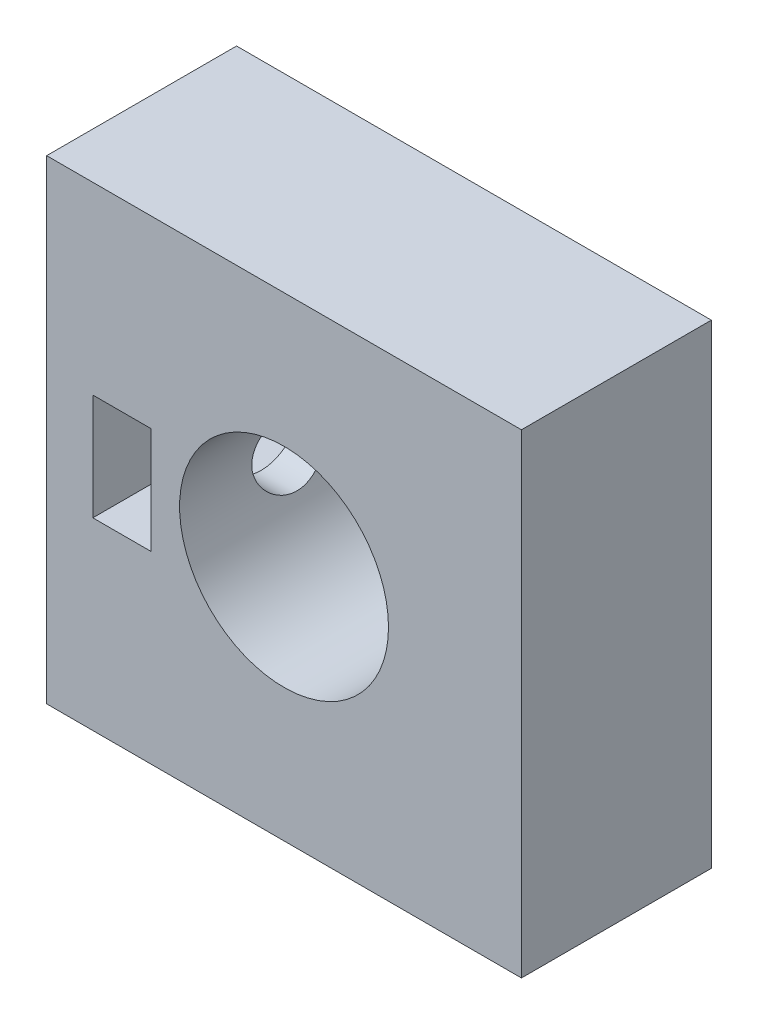
ISO-10303-21;
HEADER;
FILE_DESCRIPTION(('STEP AP214'),'2;1');
FILE_NAME('part.step','',(''),(''),'','','');
FILE_SCHEMA(('AUTOMOTIVE_DESIGN { 1 0 10303 214 1 1 1 1 }'));
ENDSEC;
DATA;
#1=APPLICATION_CONTEXT('core data for automotive mechanical design processes');
#2=APPLICATION_PROTOCOL_DEFINITION('international standard','automotive_design',2000,#1);
#3=PRODUCT_CONTEXT('',#1,'mechanical');
#4=PRODUCT('Part','Part','',(#3));
#5=PRODUCT_RELATED_PRODUCT_CATEGORY('part','',(#4));
#6=PRODUCT_DEFINITION_FORMATION('','',#4);
#7=PRODUCT_DEFINITION_CONTEXT('part definition',#1,'design');
#8=PRODUCT_DEFINITION('design','',#6,#7);
#9=PRODUCT_DEFINITION_SHAPE('','',#8);
#10=(LENGTH_UNIT() NAMED_UNIT(*) SI_UNIT(.MILLI.,.METRE.));
#11=(NAMED_UNIT(*) PLANE_ANGLE_UNIT() SI_UNIT($,.RADIAN.));
#12=(NAMED_UNIT(*) SI_UNIT($,.STERADIAN.) SOLID_ANGLE_UNIT());
#13=UNCERTAINTY_MEASURE_WITH_UNIT(LENGTH_MEASURE(1.E-05),#10,'distance_accuracy_value','');
#14=(GEOMETRIC_REPRESENTATION_CONTEXT(3) GLOBAL_UNCERTAINTY_ASSIGNED_CONTEXT((#13)) GLOBAL_UNIT_ASSIGNED_CONTEXT((#10,
#11,#12)) REPRESENTATION_CONTEXT('',''));
#15=CARTESIAN_POINT('',(0.,0.,0.));
#16=DIRECTION('',(0.,0.,1.));
#17=DIRECTION('',(1.,0.,0.));
#18=AXIS2_PLACEMENT_3D('',#15,#16,#17);
#19=CARTESIAN_POINT('',(25.001,12.5,4.2));
#20=DIRECTION('',(-1.,0.,0.));
#21=DIRECTION('',(0.,0.,1.));
#22=AXIS2_PLACEMENT_3D('',#19,#20,#21);
#23=CYLINDRICAL_SURFACE('',#22,2.);
#24=CARTESIAN_POINT('',(5.5,12.5,4.2));
#25=DIRECTION('',(1.,0.,0.));
#26=DIRECTION('',(0.,1.,0.));
#27=AXIS2_PLACEMENT_3D('',#24,#25,#26);
#28=CIRCLE('',#27,2.);
#29=CARTESIAN_POINT('',(5.5,14.5,4.2));
#30=VERTEX_POINT('',#29);
#31=EDGE_CURVE('E47',#30,#30,#28,.F.);
#32=ORIENTED_EDGE('',*,*,#31,.T.);
#33=EDGE_LOOP('',(#32));
#34=FACE_BOUND('',#33,.T.);
#35=CARTESIAN_POINT('',(7.,12.5,6.2));
#36=CARTESIAN_POINT('',(6.99999794342816,12.6085431672249,6.20000281292602));
#37=CARTESIAN_POINT('',(7.00324161817553,12.7170665360462,6.1911358052542));
#38=CARTESIAN_POINT('',(7.0158585249185,12.9308827933233,6.15603554483228));
#39=CARTESIAN_POINT('',(7.02523128593243,13.0361759293513,6.1298036264643));
#40=CARTESIAN_POINT('',(7.04909674326055,13.2404179654644,6.06101528815362));
#41=CARTESIAN_POINT('',(7.06357992514015,13.3393782541217,6.01848919169199));
#42=CARTESIAN_POINT('',(7.09621372899939,13.5287562128613,5.91846905188594));
#43=CARTESIAN_POINT('',(7.11436526886419,13.6191717365726,5.86097126133008));
#44=CARTESIAN_POINT('',(7.15326911496755,13.7925369499083,5.73021601681446));
#45=CARTESIAN_POINT('',(7.17409194403198,13.8750961278637,5.65646195228708));
#46=CARTESIAN_POINT('',(7.21563327218678,14.026983991615,5.49634225120092));
#47=CARTESIAN_POINT('',(7.23635174047298,14.0963089710615,5.40997309359733));
#48=CARTESIAN_POINT('',(7.2761461440181,14.2221704096503,5.22334495048998));
#49=CARTESIAN_POINT('',(7.29513806133193,14.2781677994308,5.12270272781146));
#50=CARTESIAN_POINT('',(7.32823877426068,14.3722693944008,4.91262852397039));
#51=CARTESIAN_POINT('',(7.34234938754203,14.4103802619401,4.8031998333952));
#52=CARTESIAN_POINT('',(7.36333912500422,14.4661067634546,4.58314134325153));
#53=CARTESIAN_POINT('',(7.37047896378303,14.4844641700975,4.47272506430788));
#54=CARTESIAN_POINT('',(7.37748422482791,14.5024821815333,4.25016624423009));
#55=CARTESIAN_POINT('',(7.37735242568596,14.5021499278993,4.13802437884144));
#56=CARTESIAN_POINT('',(7.3700551493659,14.4833676776718,3.92184779746492));
#57=CARTESIAN_POINT('',(7.36328211787463,14.4659285422237,3.81770959476474));
#58=CARTESIAN_POINT('',(7.34411489193708,14.4150924205277,3.61395353831255));
#59=CARTESIAN_POINT('',(7.33171990186375,14.3816931755481,3.51433632657303));
#60=CARTESIAN_POINT('',(7.30245712686712,14.2993004854822,3.32032363741823));
#61=CARTESIAN_POINT('',(7.28551210317722,14.250034505005,3.22605605995486));
#62=CARTESIAN_POINT('',(7.24908614062466,14.1374964656257,3.04682524845191));
#63=CARTESIAN_POINT('',(7.22960436503733,14.0742197805742,2.96186510148504));
#64=CARTESIAN_POINT('',(7.18880430043774,13.9307667594366,2.79804029049532));
#65=CARTESIAN_POINT('',(7.16744756957088,13.849777828231,2.71989508613055));
#66=CARTESIAN_POINT('',(7.12636250159321,13.675592878266,2.57808898950546));
#67=CARTESIAN_POINT('',(7.10663438598709,13.582395203464,2.51443006543378));
#68=CARTESIAN_POINT('',(7.07067780305726,13.3846914824781,2.40267283750855));
#69=CARTESIAN_POINT('',(7.05450124397144,13.280047440424,2.35480077706101));
#70=CARTESIAN_POINT('',(7.02785279306558,13.063457919123,2.27757485738342));
#71=CARTESIAN_POINT('',(7.01737852522859,12.9515155027507,2.24821328444097));
#72=CARTESIAN_POINT('',(7.00372571036465,12.7295721673527,2.21019398692595));
#73=CARTESIAN_POINT('',(7.00020577134466,12.6197581889351,2.20056653550709));
#74=CARTESIAN_POINT('',(6.99981204681246,12.4000408664372,2.19948246482137));
#75=CARTESIAN_POINT('',(7.00293689098158,12.2901375454538,2.20802209905218));
#76=CARTESIAN_POINT('',(7.01525607764047,12.0774637392691,2.24228340641591));
#77=CARTESIAN_POINT('',(7.02422990768353,11.9745786654119,2.26738122465903));
#78=CARTESIAN_POINT('',(7.04712411168664,11.7745428299039,2.33323685616544));
#79=CARTESIAN_POINT('',(7.06104512899462,11.6773928159755,2.37399670622505));
#80=CARTESIAN_POINT('',(7.09294428249921,11.4884692236079,2.47129555674054));
#81=CARTESIAN_POINT('',(7.11102727125547,11.3969295666414,2.52825334973441));
#82=CARTESIAN_POINT('',(7.14923477425007,11.2244093229434,2.65585309986756));
#83=CARTESIAN_POINT('',(7.1693600076108,11.1434324787261,2.72649988524277));
#84=CARTESIAN_POINT('',(7.21078819643165,10.9897284498612,2.88400778815019));
#85=CARTESIAN_POINT('',(7.23209558343487,10.9176910120734,2.97154255812715));
#86=CARTESIAN_POINT('',(7.27240671306496,10.7892058984758,3.15789098345244));
#87=CARTESIAN_POINT('',(7.29141031145347,10.7327591985071,3.25670534425575));
#88=CARTESIAN_POINT('',(7.32484580725239,10.6371081480892,3.46337294723393));
#89=CARTESIAN_POINT('',(7.33926798643325,10.5979403827106,3.57124479804183));
#90=CARTESIAN_POINT('',(7.36153912350902,10.5385604532528,3.79271744789138));
#91=CARTESIAN_POINT('',(7.36939182082966,10.5183375047765,3.90631494872743));
#92=CARTESIAN_POINT('',(7.37715771829315,10.4983529894228,4.12859130815924));
#93=CARTESIAN_POINT('',(7.3775237644467,10.4974243101218,4.23715036773967));
#94=CARTESIAN_POINT('',(7.37142433024002,10.5130976745463,4.45278956675328));
#95=CARTESIAN_POINT('',(7.36495942109043,10.5296982524593,4.55986982908634));
#96=CARTESIAN_POINT('',(7.34629282403714,10.5790717406572,4.76659495573479));
#97=CARTESIAN_POINT('',(7.33425053971135,10.6113964637173,4.86636245919753));
#98=CARTESIAN_POINT('',(7.30586986576045,10.6909157739188,5.05912278008991));
#99=CARTESIAN_POINT('',(7.28953042275555,10.738114007627,5.15211392925675));
#100=CARTESIAN_POINT('',(7.25337759474684,10.8487885205222,5.33374145419998));
#101=CARTESIAN_POINT('',(7.23343119744328,10.9129617358193,5.42192639618456));
#102=CARTESIAN_POINT('',(7.19279598494814,11.0546582751306,5.58665015167869));
#103=CARTESIAN_POINT('',(7.17210694266511,11.1321857107047,5.66318536470404));
#104=CARTESIAN_POINT('',(7.13108393851245,11.3029963010183,5.80629946628907));
#105=CARTESIAN_POINT('',(7.11081858749006,11.3968705459705,5.87219549980303));
#106=CARTESIAN_POINT('',(7.07402197105699,11.5950641521281,5.98723707557175));
#107=CARTESIAN_POINT('',(7.05749062423752,11.6993832855424,6.03638298302485));
#108=CARTESIAN_POINT('',(7.02980096272137,11.9175771832974,6.1169096678729));
#109=CARTESIAN_POINT('',(7.01874574097715,12.0315911395072,6.14795140397753));
#110=CARTESIAN_POINT('',(7.00384792118736,12.2637457367565,6.18949064559972));
#111=CARTESIAN_POINT('',(7.00000223793751,12.3818845905564,6.1999969390067));
#112=CARTESIAN_POINT('',(7.,12.5,6.2));
#113=B_SPLINE_CURVE_WITH_KNOTS('',3,(#35,#36,#37,#38,#39,#40,#41,#42,#43,#44,#45,#46,#47,#48,
#49,#50,#51,#52,#53,#54,#55,#56,#57,#58,#59,#60,#61,#62,#63,#64,#65,#66,#67,#68,#69,#70,#71,#72,
#73,#74,#75,#76,#77,#78,#79,#80,#81,#82,#83,#84,#85,#86,#87,#88,#89,#90,#91,#92,#93,#94,#95,#96,
#97,#98,#99,#100,#101,#102,#103,#104,#105,#106,#107,#108,#109,#110,#111,#112),.UNSPECIFIED.,.T.,
.F.,(4,2,2,2,2,2,2,2,2,2,2,2,2,2,2,2,2,2,2,2,2,2,2,2,2,2,2,2,2,2,2,2,2,2,2,2,2,2,4),(0.,
0.325194104136431,0.65036322209004,0.97493011631894,1.2995783234422,1.63601964163853,
1.97255504528971,2.32099392094053,2.66930290729856,3.00401939097088,3.33860797579858,
3.65454759073094,3.97053193181531,4.29226244373356,4.61409934564612,4.95617818949658,
5.29830348241717,5.6451379260558,5.99182774072784,6.32102805388949,6.65016048438683,
6.96755079702181,7.2849823992121,7.61151258405805,7.93815814949471,8.28259860829996,
8.62706062112335,8.97224851093866,9.31723978183251,9.64129740492555,9.96532793217199,
10.2806204101951,10.5959902492892,10.9271566786297,11.2584252518918,11.6061385710831,
11.9538443086926,12.3078682758854,12.6617407096898),.UNSPECIFIED.);
#114=CARTESIAN_POINT('',(7.,12.5,6.2));
#115=VERTEX_POINT('',#114);
#116=EDGE_CURVE('E166',#115,#115,#113,.T.);
#117=ORIENTED_EDGE('',*,*,#116,.F.);
#118=EDGE_LOOP('',(#117));
#119=FACE_BOUND('',#118,.T.);
#120=ADVANCED_FACE('F43',(#34,#119),#23,.F.);
#121=CARTESIAN_POINT('',(0.,0.,10.));
#122=DIRECTION('',(0.,0.,-1.));
#123=DIRECTION('',(-1.,0.,0.));
#124=AXIS2_PLACEMENT_3D('',#121,#122,#123);
#125=PLANE('',#124);
#126=DIRECTION('',(1.,0.,0.));
#127=VECTOR('',#126,1.);
#128=CARTESIAN_POINT('',(5.5,15.3,10.));
#129=LINE('',#128,#127);
#130=CARTESIAN_POINT('',(2.43195053206035,15.3,10.));
#131=VERTEX_POINT('',#130);
#132=CARTESIAN_POINT('',(5.5,15.3,10.));
#133=VERTEX_POINT('',#132);
#134=EDGE_CURVE('E121',#131,#133,#129,.T.);
#135=ORIENTED_EDGE('',*,*,#134,.T.);
#136=DIRECTION('',(0.,-1.,0.));
#137=VECTOR('',#136,1.);
#138=CARTESIAN_POINT('',(5.5,15.3,10.));
#139=LINE('',#138,#137);
#140=CARTESIAN_POINT('',(5.5,9.7,10.));
#141=VERTEX_POINT('',#140);
#142=EDGE_CURVE('E114',#133,#141,#139,.T.);
#143=ORIENTED_EDGE('',*,*,#142,.T.);
#144=DIRECTION('',(-1.,0.,0.));
#145=VECTOR('',#144,1.);
#146=CARTESIAN_POINT('',(5.5,9.7,10.));
#147=LINE('',#146,#145);
#148=CARTESIAN_POINT('',(2.43195053206035,9.7,10.));
#149=VERTEX_POINT('',#148);
#150=EDGE_CURVE('E124',#141,#149,#147,.T.);
#151=ORIENTED_EDGE('',*,*,#150,.T.);
#152=DIRECTION('',(0.,1.,0.));
#153=VECTOR('',#152,1.);
#154=CARTESIAN_POINT('',(2.43195053206035,15.3,10.));
#155=LINE('',#154,#153);
#156=EDGE_CURVE('E61',#149,#131,#155,.T.);
#157=ORIENTED_EDGE('',*,*,#156,.T.);
#158=EDGE_LOOP('',(#135,#143,#151,#157));
#159=FACE_BOUND('',#158,.T.);
#160=DIRECTION('',(0.,-1.,0.));
#161=VECTOR('',#160,1.);
#162=CARTESIAN_POINT('',(0.,0.,10.));
#163=LINE('',#162,#161);
#164=CARTESIAN_POINT('',(0.,25.,10.));
#165=VERTEX_POINT('',#164);
#166=CARTESIAN_POINT('',(0.,0.,10.));
#167=VERTEX_POINT('',#166);
#168=EDGE_CURVE('E246',#165,#167,#163,.T.);
#169=ORIENTED_EDGE('',*,*,#168,.T.);
#170=DIRECTION('',(1.,0.,0.));
#171=VECTOR('',#170,1.);
#172=CARTESIAN_POINT('',(0.,0.,10.));
#173=LINE('',#172,#171);
#174=CARTESIAN_POINT('',(25.,0.,10.));
#175=VERTEX_POINT('',#174);
#176=EDGE_CURVE('E266',#167,#175,#173,.T.);
#177=ORIENTED_EDGE('',*,*,#176,.T.);
#178=DIRECTION('',(0.,1.,0.));
#179=VECTOR('',#178,1.);
#180=CARTESIAN_POINT('',(25.,0.,10.));
#181=LINE('',#180,#179);
#182=CARTESIAN_POINT('',(25.,25.,10.));
#183=VERTEX_POINT('',#182);
#184=EDGE_CURVE('E268',#175,#183,#181,.T.);
#185=ORIENTED_EDGE('',*,*,#184,.T.);
#186=DIRECTION('',(-1.,0.,0.));
#187=VECTOR('',#186,1.);
#188=CARTESIAN_POINT('',(0.,25.,10.));
#189=LINE('',#188,#187);
#190=EDGE_CURVE('E238',#183,#165,#189,.T.);
#191=ORIENTED_EDGE('',*,*,#190,.T.);
#192=EDGE_LOOP('',(#169,#177,#185,#191));
#193=FACE_BOUND('',#192,.T.);
#194=CARTESIAN_POINT('',(12.5,12.5,10.));
#195=DIRECTION('',(0.,0.,1.));
#196=DIRECTION('',(1.,0.,0.));
#197=AXIS2_PLACEMENT_3D('',#194,#195,#196);
#198=CIRCLE('',#197,5.5);
#199=CARTESIAN_POINT('',(18.,12.5,10.));
#200=VERTEX_POINT('',#199);
#201=EDGE_CURVE('E175',#200,#200,#198,.T.);
#202=ORIENTED_EDGE('',*,*,#201,.F.);
#203=EDGE_LOOP('',(#202));
#204=FACE_BOUND('',#203,.T.);
#205=ADVANCED_FACE('F129',(#159,#193,#204),#125,.F.);
#206=CARTESIAN_POINT('',(0.,0.,0.));
#207=DIRECTION('',(0.,0.,-1.));
#208=DIRECTION('',(-1.,0.,0.));
#209=AXIS2_PLACEMENT_3D('',#206,#207,#208);
#210=PLANE('',#209);
#211=DIRECTION('',(0.,-1.,0.));
#212=VECTOR('',#211,1.);
#213=CARTESIAN_POINT('',(5.5,15.3,0.));
#214=LINE('',#213,#212);
#215=CARTESIAN_POINT('',(5.5,15.3,0.));
#216=VERTEX_POINT('',#215);
#217=CARTESIAN_POINT('',(5.5,9.7,0.));
#218=VERTEX_POINT('',#217);
#219=EDGE_CURVE('E69',#216,#218,#214,.T.);
#220=ORIENTED_EDGE('',*,*,#219,.F.);
#221=DIRECTION('',(1.,0.,0.));
#222=VECTOR('',#221,1.);
#223=CARTESIAN_POINT('',(5.5,15.3,0.));
#224=LINE('',#223,#222);
#225=CARTESIAN_POINT('',(2.43195053206035,15.3,0.));
#226=VERTEX_POINT('',#225);
#227=EDGE_CURVE('E133',#226,#216,#224,.T.);
#228=ORIENTED_EDGE('',*,*,#227,.F.);
#229=DIRECTION('',(0.,1.,0.));
#230=VECTOR('',#229,1.);
#231=CARTESIAN_POINT('',(2.43195053206035,15.3,0.));
#232=LINE('',#231,#230);
#233=CARTESIAN_POINT('',(2.43195053206035,9.7,0.));
#234=VERTEX_POINT('',#233);
#235=EDGE_CURVE('E137',#234,#226,#232,.T.);
#236=ORIENTED_EDGE('',*,*,#235,.F.);
#237=DIRECTION('',(-1.,0.,0.));
#238=VECTOR('',#237,1.);
#239=CARTESIAN_POINT('',(5.5,9.7,0.));
#240=LINE('',#239,#238);
#241=EDGE_CURVE('E146',#218,#234,#240,.T.);
#242=ORIENTED_EDGE('',*,*,#241,.F.);
#243=EDGE_LOOP('',(#220,#228,#236,#242));
#244=FACE_BOUND('',#243,.T.);
#245=DIRECTION('',(0.,-1.,0.));
#246=VECTOR('',#245,1.);
#247=CARTESIAN_POINT('',(0.,0.,0.));
#248=LINE('',#247,#246);
#249=CARTESIAN_POINT('',(0.,25.,0.));
#250=VERTEX_POINT('',#249);
#251=CARTESIAN_POINT('',(0.,0.,0.));
#252=VERTEX_POINT('',#251);
#253=EDGE_CURVE('E223',#250,#252,#248,.T.);
#254=ORIENTED_EDGE('',*,*,#253,.F.);
#255=DIRECTION('',(-1.,0.,0.));
#256=VECTOR('',#255,1.);
#257=CARTESIAN_POINT('',(0.,25.,0.));
#258=LINE('',#257,#256);
#259=CARTESIAN_POINT('',(25.,25.,0.));
#260=VERTEX_POINT('',#259);
#261=EDGE_CURVE('E243',#260,#250,#258,.T.);
#262=ORIENTED_EDGE('',*,*,#261,.F.);
#263=DIRECTION('',(0.,1.,0.));
#264=VECTOR('',#263,1.);
#265=CARTESIAN_POINT('',(25.,0.,0.));
#266=LINE('',#265,#264);
#267=CARTESIAN_POINT('',(25.,0.,0.));
#268=VERTEX_POINT('',#267);
#269=EDGE_CURVE('E234',#268,#260,#266,.T.);
#270=ORIENTED_EDGE('',*,*,#269,.F.);
#271=DIRECTION('',(1.,0.,0.));
#272=VECTOR('',#271,1.);
#273=CARTESIAN_POINT('',(0.,0.,0.));
#274=LINE('',#273,#272);
#275=EDGE_CURVE('E230',#252,#268,#274,.T.);
#276=ORIENTED_EDGE('',*,*,#275,.F.);
#277=EDGE_LOOP('',(#254,#262,#270,#276));
#278=FACE_BOUND('',#277,.T.);
#279=CARTESIAN_POINT('',(12.5,12.5,0.));
#280=DIRECTION('',(0.,0.,1.));
#281=DIRECTION('',(1.,0.,0.));
#282=AXIS2_PLACEMENT_3D('',#279,#280,#281);
#283=CIRCLE('',#282,5.5);
#284=CARTESIAN_POINT('',(18.,12.5,0.));
#285=VERTEX_POINT('',#284);
#286=EDGE_CURVE('E165',#285,#285,#283,.T.);
#287=ORIENTED_EDGE('',*,*,#286,.T.);
#288=EDGE_LOOP('',(#287));
#289=FACE_BOUND('',#288,.T.);
#290=ADVANCED_FACE('F199',(#244,#278,#289),#210,.T.);
#291=CARTESIAN_POINT('',(0.,0.,10.));
#292=DIRECTION('',(1.,0.,0.));
#293=DIRECTION('',(0.,0.,-1.));
#294=AXIS2_PLACEMENT_3D('',#291,#292,#293);
#295=PLANE('',#294);
#296=CARTESIAN_POINT('',(0.,12.5,4.2));
#297=DIRECTION('',(-1.,0.,0.));
#298=DIRECTION('',(0.,0.,1.));
#299=AXIS2_PLACEMENT_3D('',#296,#297,#298);
#300=CIRCLE('',#299,2.);
#301=CARTESIAN_POINT('',(0.,12.5,6.2));
#302=VERTEX_POINT('',#301);
#303=EDGE_CURVE('E161',#302,#302,#300,.T.);
#304=ORIENTED_EDGE('',*,*,#303,.F.);
#305=EDGE_LOOP('',(#304));
#306=FACE_BOUND('',#305,.T.);
#307=ORIENTED_EDGE('',*,*,#253,.T.);
#308=DIRECTION('',(0.,0.,-1.));
#309=VECTOR('',#308,1.);
#310=CARTESIAN_POINT('',(0.,0.,10.));
#311=LINE('',#310,#309);
#312=EDGE_CURVE('E11',#167,#252,#311,.T.);
#313=ORIENTED_EDGE('',*,*,#312,.F.);
#314=ORIENTED_EDGE('',*,*,#168,.F.);
#315=DIRECTION('',(0.,0.,-1.));
#316=VECTOR('',#315,1.);
#317=CARTESIAN_POINT('',(0.,25.,10.));
#318=LINE('',#317,#316);
#319=EDGE_CURVE('E226',#165,#250,#318,.T.);
#320=ORIENTED_EDGE('',*,*,#319,.T.);
#321=EDGE_LOOP('',(#307,#313,#314,#320));
#322=FACE_BOUND('',#321,.T.);
#323=ADVANCED_FACE('F45',(#306,#322),#295,.F.);
#324=CARTESIAN_POINT('',(0.,0.,10.));
#325=DIRECTION('',(0.,1.,0.));
#326=DIRECTION('',(0.,0.,1.));
#327=AXIS2_PLACEMENT_3D('',#324,#325,#326);
#328=PLANE('',#327);
#329=ORIENTED_EDGE('',*,*,#275,.T.);
#330=DIRECTION('',(0.,0.,-1.));
#331=VECTOR('',#330,1.);
#332=CARTESIAN_POINT('',(25.,0.,10.));
#333=LINE('',#332,#331);
#334=EDGE_CURVE('E53',#175,#268,#333,.T.);
#335=ORIENTED_EDGE('',*,*,#334,.F.);
#336=ORIENTED_EDGE('',*,*,#176,.F.);
#337=ORIENTED_EDGE('',*,*,#312,.T.);
#338=EDGE_LOOP('',(#329,#335,#336,#337));
#339=FACE_BOUND('',#338,.T.);
#340=ADVANCED_FACE('F218',(#339),#328,.F.);
#341=CARTESIAN_POINT('',(25.,0.,10.));
#342=DIRECTION('',(-1.,0.,0.));
#343=DIRECTION('',(0.,0.,1.));
#344=AXIS2_PLACEMENT_3D('',#341,#342,#343);
#345=PLANE('',#344);
#346=ORIENTED_EDGE('',*,*,#269,.T.);
#347=DIRECTION('',(0.,0.,-1.));
#348=VECTOR('',#347,1.);
#349=CARTESIAN_POINT('',(25.,25.,10.));
#350=LINE('',#349,#348);
#351=EDGE_CURVE('E249',#183,#260,#350,.T.);
#352=ORIENTED_EDGE('',*,*,#351,.F.);
#353=ORIENTED_EDGE('',*,*,#184,.F.);
#354=ORIENTED_EDGE('',*,*,#334,.T.);
#355=EDGE_LOOP('',(#346,#352,#353,#354));
#356=FACE_BOUND('',#355,.T.);
#357=ADVANCED_FACE('F278',(#356),#345,.F.);
#358=CARTESIAN_POINT('',(0.,25.,10.));
#359=DIRECTION('',(0.,-1.,0.));
#360=DIRECTION('',(0.,0.,-1.));
#361=AXIS2_PLACEMENT_3D('',#358,#359,#360);
#362=PLANE('',#361);
#363=ORIENTED_EDGE('',*,*,#261,.T.);
#364=ORIENTED_EDGE('',*,*,#319,.F.);
#365=ORIENTED_EDGE('',*,*,#190,.F.);
#366=ORIENTED_EDGE('',*,*,#351,.T.);
#367=EDGE_LOOP('',(#363,#364,#365,#366));
#368=FACE_BOUND('',#367,.T.);
#369=ADVANCED_FACE('F209',(#368),#362,.F.);
#370=CARTESIAN_POINT('',(12.5,12.5,10.));
#371=DIRECTION('',(0.,0.,-1.));
#372=DIRECTION('',(-1.,0.,0.));
#373=AXIS2_PLACEMENT_3D('',#370,#371,#372);
#374=CYLINDRICAL_SURFACE('',#373,5.5);
#375=ORIENTED_EDGE('',*,*,#116,.T.);
#376=EDGE_LOOP('',(#375));
#377=FACE_BOUND('',#376,.T.);
#378=ORIENTED_EDGE('',*,*,#201,.T.);
#379=EDGE_LOOP('',(#378));
#380=FACE_BOUND('',#379,.T.);
#381=ORIENTED_EDGE('',*,*,#286,.F.);
#382=EDGE_LOOP('',(#381));
#383=FACE_BOUND('',#382,.T.);
#384=ADVANCED_FACE('F204',(#377,#380,#383),#374,.F.);
#385=CARTESIAN_POINT('',(2.43195053206035,12.5,4.2));
#386=DIRECTION('',(-1.,0.,0.));
#387=DIRECTION('',(0.,-1.,0.));
#388=AXIS2_PLACEMENT_3D('',#385,#386,#387);
#389=CIRCLE('',#388,2.);
#390=CARTESIAN_POINT('',(2.43195053206035,10.5,4.2));
#391=VERTEX_POINT('',#390);
#392=EDGE_CURVE('E155',#391,#391,#389,.F.);
#393=ORIENTED_EDGE('',*,*,#392,.T.);
#394=EDGE_LOOP('',(#393));
#395=FACE_BOUND('',#394,.T.);
#396=ORIENTED_EDGE('',*,*,#303,.T.);
#397=EDGE_LOOP('',(#396));
#398=FACE_BOUND('',#397,.T.);
#399=ADVANCED_FACE('F177',(#395,#398),#23,.F.);
#400=CARTESIAN_POINT('',(5.5,15.3,10.));
#401=DIRECTION('',(1.,0.,0.));
#402=DIRECTION('',(0.,1.,0.));
#403=AXIS2_PLACEMENT_3D('',#400,#401,#402);
#404=PLANE('',#403);
#405=ORIENTED_EDGE('',*,*,#219,.T.);
#406=DIRECTION('',(0.,0.,-1.));
#407=VECTOR('',#406,1.);
#408=CARTESIAN_POINT('',(5.5,9.7,10.));
#409=LINE('',#408,#407);
#410=EDGE_CURVE('E109',#141,#218,#409,.T.);
#411=ORIENTED_EDGE('',*,*,#410,.F.);
#412=ORIENTED_EDGE('',*,*,#142,.F.);
#413=DIRECTION('',(0.,0.,-1.));
#414=VECTOR('',#413,1.);
#415=CARTESIAN_POINT('',(5.5,15.3,10.));
#416=LINE('',#415,#414);
#417=EDGE_CURVE('E152',#133,#216,#416,.T.);
#418=ORIENTED_EDGE('',*,*,#417,.T.);
#419=EDGE_LOOP('',(#405,#411,#412,#418));
#420=FACE_BOUND('',#419,.T.);
#421=ORIENTED_EDGE('',*,*,#31,.F.);
#422=EDGE_LOOP('',(#421));
#423=FACE_BOUND('',#422,.T.);
#424=ADVANCED_FACE('F111',(#420,#423),#404,.F.);
#425=CARTESIAN_POINT('',(2.43195053206035,15.3,10.));
#426=DIRECTION('',(-1.,0.,0.));
#427=DIRECTION('',(0.,-1.,0.));
#428=AXIS2_PLACEMENT_3D('',#425,#426,#427);
#429=PLANE('',#428);
#430=ORIENTED_EDGE('',*,*,#235,.T.);
#431=DIRECTION('',(0.,0.,-1.));
#432=VECTOR('',#431,1.);
#433=CARTESIAN_POINT('',(2.43195053206035,15.3,10.));
#434=LINE('',#433,#432);
#435=EDGE_CURVE('E156',#131,#226,#434,.T.);
#436=ORIENTED_EDGE('',*,*,#435,.F.);
#437=ORIENTED_EDGE('',*,*,#156,.F.);
#438=DIRECTION('',(0.,0.,-1.));
#439=VECTOR('',#438,1.);
#440=CARTESIAN_POINT('',(2.43195053206035,9.7,10.));
#441=LINE('',#440,#439);
#442=EDGE_CURVE('E120',#149,#234,#441,.T.);
#443=ORIENTED_EDGE('',*,*,#442,.T.);
#444=EDGE_LOOP('',(#430,#436,#437,#443));
#445=FACE_BOUND('',#444,.T.);
#446=ORIENTED_EDGE('',*,*,#392,.F.);
#447=EDGE_LOOP('',(#446));
#448=FACE_BOUND('',#447,.T.);
#449=ADVANCED_FACE('F184',(#445,#448),#429,.F.);
#450=CARTESIAN_POINT('',(5.5,15.3,10.));
#451=DIRECTION('',(0.,1.,0.));
#452=DIRECTION('',(0.,0.,1.));
#453=AXIS2_PLACEMENT_3D('',#450,#451,#452);
#454=PLANE('',#453);
#455=ORIENTED_EDGE('',*,*,#227,.T.);
#456=ORIENTED_EDGE('',*,*,#417,.F.);
#457=ORIENTED_EDGE('',*,*,#134,.F.);
#458=ORIENTED_EDGE('',*,*,#435,.T.);
#459=EDGE_LOOP('',(#455,#456,#457,#458));
#460=FACE_BOUND('',#459,.T.);
#461=ADVANCED_FACE('F187',(#460),#454,.F.);
#462=CARTESIAN_POINT('',(5.5,9.7,10.));
#463=DIRECTION('',(0.,-1.,0.));
#464=DIRECTION('',(0.,0.,-1.));
#465=AXIS2_PLACEMENT_3D('',#462,#463,#464);
#466=PLANE('',#465);
#467=ORIENTED_EDGE('',*,*,#241,.T.);
#468=ORIENTED_EDGE('',*,*,#442,.F.);
#469=ORIENTED_EDGE('',*,*,#150,.F.);
#470=ORIENTED_EDGE('',*,*,#410,.T.);
#471=EDGE_LOOP('',(#467,#468,#469,#470));
#472=FACE_BOUND('',#471,.T.);
#473=ADVANCED_FACE('F125',(#472),#466,.F.);
#474=CLOSED_SHELL('',(#120,#205,#290,#323,#340,#357,#369,#384,#399,#424,#449,#461,#473));
#475=MANIFOLD_SOLID_BREP('B2',#474);
#476=ADVANCED_BREP_SHAPE_REPRESENTATION('',(#18,#475),#14);
#477=SHAPE_DEFINITION_REPRESENTATION(#9,#476);
ENDSEC;
END-ISO-10303-21;
